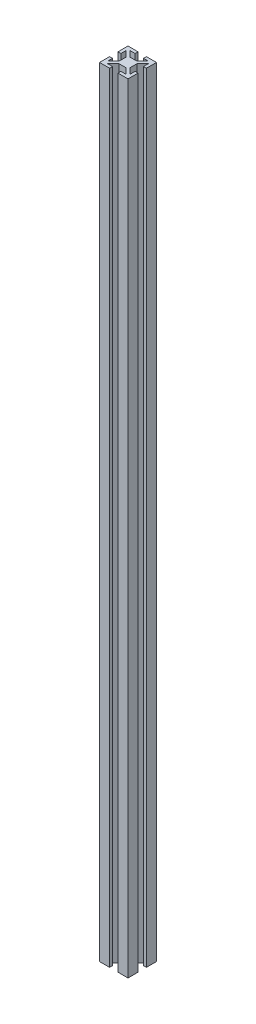
ISO-10303-21;
HEADER;
FILE_DESCRIPTION(('STEP AP214'),'2;1');
FILE_NAME('part.step','',(''),(''),'','','');
FILE_SCHEMA(('AUTOMOTIVE_DESIGN { 1 0 10303 214 1 1 1 1 }'));
ENDSEC;
DATA;
#1=APPLICATION_CONTEXT('core data for automotive mechanical design processes');
#2=APPLICATION_PROTOCOL_DEFINITION('international standard','automotive_design',2000,#1);
#3=PRODUCT_CONTEXT('',#1,'mechanical');
#4=PRODUCT('Part','Part','',(#3));
#5=PRODUCT_RELATED_PRODUCT_CATEGORY('part','',(#4));
#6=PRODUCT_DEFINITION_FORMATION('','',#4);
#7=PRODUCT_DEFINITION_CONTEXT('part definition',#1,'design');
#8=PRODUCT_DEFINITION('design','',#6,#7);
#9=PRODUCT_DEFINITION_SHAPE('','',#8);
#10=(LENGTH_UNIT() NAMED_UNIT(*) SI_UNIT(.MILLI.,.METRE.));
#11=(NAMED_UNIT(*) PLANE_ANGLE_UNIT() SI_UNIT($,.RADIAN.));
#12=(NAMED_UNIT(*) SI_UNIT($,.STERADIAN.) SOLID_ANGLE_UNIT());
#13=UNCERTAINTY_MEASURE_WITH_UNIT(LENGTH_MEASURE(1.E-05),#10,'distance_accuracy_value','');
#14=(GEOMETRIC_REPRESENTATION_CONTEXT(3) GLOBAL_UNCERTAINTY_ASSIGNED_CONTEXT((#13)) GLOBAL_UNIT_ASSIGNED_CONTEXT((#10,
#11,#12)) REPRESENTATION_CONTEXT('',''));
#15=CARTESIAN_POINT('',(0.,0.,0.));
#16=DIRECTION('',(0.,0.,1.));
#17=DIRECTION('',(1.,0.,0.));
#18=AXIS2_PLACEMENT_3D('',#15,#16,#17);
#19=CARTESIAN_POINT('',(4.1,762.,-13.925));
#20=DIRECTION('',(0.,0.,1.));
#21=DIRECTION('',(1.,0.,0.));
#22=AXIS2_PLACEMENT_3D('',#19,#20,#21);
#23=PLANE('',#22);
#24=DIRECTION('',(-1.,0.,0.));
#25=VECTOR('',#24,1.);
#26=CARTESIAN_POINT('',(4.1,0.,-13.925));
#27=LINE('',#26,#25);
#28=CARTESIAN_POINT('',(13.925,0.,-13.925));
#29=VERTEX_POINT('',#28);
#30=CARTESIAN_POINT('',(4.1,0.,-13.925));
#31=VERTEX_POINT('',#30);
#32=EDGE_CURVE('E314',#29,#31,#27,.T.);
#33=ORIENTED_EDGE('',*,*,#32,.T.);
#34=DIRECTION('',(0.,-1.,0.));
#35=VECTOR('',#34,1.);
#36=CARTESIAN_POINT('',(4.1,762.,-13.925));
#37=LINE('',#36,#35);
#38=CARTESIAN_POINT('',(4.1,762.,-13.925));
#39=VERTEX_POINT('',#38);
#40=EDGE_CURVE('E11',#39,#31,#37,.T.);
#41=ORIENTED_EDGE('',*,*,#40,.F.);
#42=DIRECTION('',(-1.,0.,0.));
#43=VECTOR('',#42,1.);
#44=CARTESIAN_POINT('',(4.1,762.,-13.925));
#45=LINE('',#44,#43);
#46=CARTESIAN_POINT('',(13.925,762.,-13.925));
#47=VERTEX_POINT('',#46);
#48=EDGE_CURVE('E420',#47,#39,#45,.T.);
#49=ORIENTED_EDGE('',*,*,#48,.F.);
#50=DIRECTION('',(0.,-1.,0.));
#51=VECTOR('',#50,1.);
#52=CARTESIAN_POINT('',(13.925,762.,-13.925));
#53=LINE('',#52,#51);
#54=EDGE_CURVE('E310',#47,#29,#53,.T.);
#55=ORIENTED_EDGE('',*,*,#54,.T.);
#56=EDGE_LOOP('',(#33,#41,#49,#55));
#57=FACE_BOUND('',#56,.T.);
#58=ADVANCED_FACE('F45',(#57),#23,.F.);
#59=CARTESIAN_POINT('',(4.1,762.,-13.925));
#60=DIRECTION('',(1.,0.,0.));
#61=DIRECTION('',(0.,0.,-1.));
#62=AXIS2_PLACEMENT_3D('',#59,#60,#61);
#63=PLANE('',#62);
#64=DIRECTION('',(0.,0.,1.));
#65=VECTOR('',#64,1.);
#66=CARTESIAN_POINT('',(4.1,0.,-13.925));
#67=LINE('',#66,#65);
#68=CARTESIAN_POINT('',(4.1,0.,-11.0400017946875));
#69=VERTEX_POINT('',#68);
#70=EDGE_CURVE('E318',#31,#69,#67,.T.);
#71=ORIENTED_EDGE('',*,*,#70,.T.);
#72=DIRECTION('',(0.,-1.,0.));
#73=VECTOR('',#72,1.);
#74=CARTESIAN_POINT('',(4.1,762.,-11.0400017946875));
#75=LINE('',#74,#73);
#76=CARTESIAN_POINT('',(4.1,762.,-11.0400017946875));
#77=VERTEX_POINT('',#76);
#78=EDGE_CURVE('E54',#77,#69,#75,.T.);
#79=ORIENTED_EDGE('',*,*,#78,.F.);
#80=DIRECTION('',(0.,0.,1.));
#81=VECTOR('',#80,1.);
#82=CARTESIAN_POINT('',(4.1,762.,-13.925));
#83=LINE('',#82,#81);
#84=EDGE_CURVE('E189',#39,#77,#83,.T.);
#85=ORIENTED_EDGE('',*,*,#84,.F.);
#86=ORIENTED_EDGE('',*,*,#40,.T.);
#87=EDGE_LOOP('',(#71,#79,#85,#86));
#88=FACE_BOUND('',#87,.T.);
#89=ADVANCED_FACE('F682',(#88),#63,.F.);
#90=CARTESIAN_POINT('',(4.1,762.,-11.0400017946875));
#91=DIRECTION('',(0.,0.,-1.));
#92=DIRECTION('',(-1.,0.,0.));
#93=AXIS2_PLACEMENT_3D('',#90,#91,#92);
#94=PLANE('',#93);
#95=DIRECTION('',(1.,0.,0.));
#96=VECTOR('',#95,1.);
#97=CARTESIAN_POINT('',(4.1,0.,-11.0400017946875));
#98=LINE('',#97,#96);
#99=CARTESIAN_POINT('',(9.,0.,-11.0400017946875));
#100=VERTEX_POINT('',#99);
#101=EDGE_CURVE('E321',#69,#100,#98,.T.);
#102=ORIENTED_EDGE('',*,*,#101,.T.);
#103=DIRECTION('',(0.,-1.,0.));
#104=VECTOR('',#103,1.);
#105=CARTESIAN_POINT('',(9.,762.,-11.0400017946875));
#106=LINE('',#105,#104);
#107=CARTESIAN_POINT('',(9.,762.,-11.0400017946875));
#108=VERTEX_POINT('',#107);
#109=EDGE_CURVE('E543',#108,#100,#106,.T.);
#110=ORIENTED_EDGE('',*,*,#109,.F.);
#111=DIRECTION('',(1.,0.,0.));
#112=VECTOR('',#111,1.);
#113=CARTESIAN_POINT('',(4.1,762.,-11.0400017946875));
#114=LINE('',#113,#112);
#115=EDGE_CURVE('E553',#77,#108,#114,.T.);
#116=ORIENTED_EDGE('',*,*,#115,.F.);
#117=ORIENTED_EDGE('',*,*,#78,.T.);
#118=EDGE_LOOP('',(#102,#110,#116,#117));
#119=FACE_BOUND('',#118,.T.);
#120=ADVANCED_FACE('F551',(#119),#94,.F.);
#121=CARTESIAN_POINT('',(9.,762.,-11.0400017946875));
#122=DIRECTION('',(0.707106781186548,0.,0.707106781186547));
#123=DIRECTION('',(0.707106781186547,0.,-0.707106781186548));
#124=AXIS2_PLACEMENT_3D('',#121,#122,#123);
#125=PLANE('',#124);
#126=DIRECTION('',(-0.707106781186547,0.,0.707106781186548));
#127=VECTOR('',#126,1.);
#128=CARTESIAN_POINT('',(9.,0.,-11.0400017946875));
#129=LINE('',#128,#127);
#130=CARTESIAN_POINT('',(3.44499820531251,0.,-5.485));
#131=VERTEX_POINT('',#130);
#132=EDGE_CURVE('E324',#100,#131,#129,.T.);
#133=ORIENTED_EDGE('',*,*,#132,.T.);
#134=DIRECTION('',(0.,-1.,0.));
#135=VECTOR('',#134,1.);
#136=CARTESIAN_POINT('',(3.44499820531251,762.,-5.485));
#137=LINE('',#136,#135);
#138=CARTESIAN_POINT('',(3.44499820531251,762.,-5.485));
#139=VERTEX_POINT('',#138);
#140=EDGE_CURVE('E539',#139,#131,#137,.T.);
#141=ORIENTED_EDGE('',*,*,#140,.F.);
#142=DIRECTION('',(-0.707106781186547,0.,0.707106781186548));
#143=VECTOR('',#142,1.);
#144=CARTESIAN_POINT('',(9.,762.,-11.0400017946875));
#145=LINE('',#144,#143);
#146=EDGE_CURVE('E572',#108,#139,#145,.T.);
#147=ORIENTED_EDGE('',*,*,#146,.F.);
#148=ORIENTED_EDGE('',*,*,#109,.T.);
#149=EDGE_LOOP('',(#133,#141,#147,#148));
#150=FACE_BOUND('',#149,.T.);
#151=ADVANCED_FACE('F562',(#150),#125,.F.);
#152=CARTESIAN_POINT('',(3.44499820531251,762.,-5.485));
#153=DIRECTION('',(0.,0.,1.));
#154=DIRECTION('',(1.,0.,0.));
#155=AXIS2_PLACEMENT_3D('',#152,#153,#154);
#156=PLANE('',#155);
#157=DIRECTION('',(-1.,0.,0.));
#158=VECTOR('',#157,1.);
#159=CARTESIAN_POINT('',(3.44499820531251,0.,-5.485));
#160=LINE('',#159,#158);
#161=CARTESIAN_POINT('',(-3.44499820531251,0.,-5.485));
#162=VERTEX_POINT('',#161);
#163=EDGE_CURVE('E327',#131,#162,#160,.T.);
#164=ORIENTED_EDGE('',*,*,#163,.T.);
#165=DIRECTION('',(0.,-1.,0.));
#166=VECTOR('',#165,1.);
#167=CARTESIAN_POINT('',(-3.44499820531251,762.,-5.485));
#168=LINE('',#167,#166);
#169=CARTESIAN_POINT('',(-3.44499820531251,762.,-5.485));
#170=VERTEX_POINT('',#169);
#171=EDGE_CURVE('E535',#170,#162,#168,.T.);
#172=ORIENTED_EDGE('',*,*,#171,.F.);
#173=DIRECTION('',(-1.,0.,0.));
#174=VECTOR('',#173,1.);
#175=CARTESIAN_POINT('',(3.44499820531251,762.,-5.485));
#176=LINE('',#175,#174);
#177=EDGE_CURVE('E568',#139,#170,#176,.T.);
#178=ORIENTED_EDGE('',*,*,#177,.F.);
#179=ORIENTED_EDGE('',*,*,#140,.T.);
#180=EDGE_LOOP('',(#164,#172,#178,#179));
#181=FACE_BOUND('',#180,.T.);
#182=ADVANCED_FACE('F566',(#181),#156,.F.);
#183=CARTESIAN_POINT('',(-9.,762.,-11.0400017946875));
#184=DIRECTION('',(-0.707106781186548,0.,0.707106781186547));
#185=DIRECTION('',(0.707106781186547,0.,0.707106781186548));
#186=AXIS2_PLACEMENT_3D('',#183,#184,#185);
#187=PLANE('',#186);
#188=DIRECTION('',(-0.707106781186547,0.,-0.707106781186548));
#189=VECTOR('',#188,1.);
#190=CARTESIAN_POINT('',(-9.,0.,-11.0400017946875));
#191=LINE('',#190,#189);
#192=CARTESIAN_POINT('',(-9.,0.,-11.0400017946875));
#193=VERTEX_POINT('',#192);
#194=EDGE_CURVE('E330',#162,#193,#191,.T.);
#195=ORIENTED_EDGE('',*,*,#194,.T.);
#196=DIRECTION('',(0.,-1.,0.));
#197=VECTOR('',#196,1.);
#198=CARTESIAN_POINT('',(-9.,762.,-11.0400017946875));
#199=LINE('',#198,#197);
#200=CARTESIAN_POINT('',(-9.,762.,-11.0400017946875));
#201=VERTEX_POINT('',#200);
#202=EDGE_CURVE('E531',#201,#193,#199,.T.);
#203=ORIENTED_EDGE('',*,*,#202,.F.);
#204=DIRECTION('',(-0.707106781186547,0.,-0.707106781186548));
#205=VECTOR('',#204,1.);
#206=CARTESIAN_POINT('',(-9.,762.,-11.0400017946875));
#207=LINE('',#206,#205);
#208=EDGE_CURVE('E571',#170,#201,#207,.T.);
#209=ORIENTED_EDGE('',*,*,#208,.F.);
#210=ORIENTED_EDGE('',*,*,#171,.T.);
#211=EDGE_LOOP('',(#195,#203,#209,#210));
#212=FACE_BOUND('',#211,.T.);
#213=ADVANCED_FACE('F695',(#212),#187,.F.);
#214=CARTESIAN_POINT('',(-4.1,762.,-11.0400017946875));
#215=DIRECTION('',(0.,0.,-1.));
#216=DIRECTION('',(-1.,0.,0.));
#217=AXIS2_PLACEMENT_3D('',#214,#215,#216);
#218=PLANE('',#217);
#219=DIRECTION('',(1.,0.,0.));
#220=VECTOR('',#219,1.);
#221=CARTESIAN_POINT('',(-4.1,0.,-11.0400017946875));
#222=LINE('',#221,#220);
#223=CARTESIAN_POINT('',(-4.1,0.,-11.0400017946875));
#224=VERTEX_POINT('',#223);
#225=EDGE_CURVE('E333',#193,#224,#222,.T.);
#226=ORIENTED_EDGE('',*,*,#225,.T.);
#227=DIRECTION('',(0.,-1.,0.));
#228=VECTOR('',#227,1.);
#229=CARTESIAN_POINT('',(-4.1,762.,-11.0400017946875));
#230=LINE('',#229,#228);
#231=CARTESIAN_POINT('',(-4.1,762.,-11.0400017946875));
#232=VERTEX_POINT('',#231);
#233=EDGE_CURVE('E527',#232,#224,#230,.T.);
#234=ORIENTED_EDGE('',*,*,#233,.F.);
#235=DIRECTION('',(1.,0.,0.));
#236=VECTOR('',#235,1.);
#237=CARTESIAN_POINT('',(-4.1,762.,-11.0400017946875));
#238=LINE('',#237,#236);
#239=EDGE_CURVE('E576',#201,#232,#238,.T.);
#240=ORIENTED_EDGE('',*,*,#239,.F.);
#241=ORIENTED_EDGE('',*,*,#202,.T.);
#242=EDGE_LOOP('',(#226,#234,#240,#241));
#243=FACE_BOUND('',#242,.T.);
#244=ADVANCED_FACE('F698',(#243),#218,.F.);
#245=CARTESIAN_POINT('',(-4.1,762.,-13.925));
#246=DIRECTION('',(-1.,0.,0.));
#247=DIRECTION('',(0.,0.,1.));
#248=AXIS2_PLACEMENT_3D('',#245,#246,#247);
#249=PLANE('',#248);
#250=DIRECTION('',(0.,0.,-1.));
#251=VECTOR('',#250,1.);
#252=CARTESIAN_POINT('',(-4.1,0.,-13.925));
#253=LINE('',#252,#251);
#254=CARTESIAN_POINT('',(-4.1,0.,-13.925));
#255=VERTEX_POINT('',#254);
#256=EDGE_CURVE('E336',#224,#255,#253,.T.);
#257=ORIENTED_EDGE('',*,*,#256,.T.);
#258=DIRECTION('',(0.,-1.,0.));
#259=VECTOR('',#258,1.);
#260=CARTESIAN_POINT('',(-4.1,762.,-13.925));
#261=LINE('',#260,#259);
#262=CARTESIAN_POINT('',(-4.1,762.,-13.925));
#263=VERTEX_POINT('',#262);
#264=EDGE_CURVE('E523',#263,#255,#261,.T.);
#265=ORIENTED_EDGE('',*,*,#264,.F.);
#266=DIRECTION('',(0.,0.,-1.));
#267=VECTOR('',#266,1.);
#268=CARTESIAN_POINT('',(-4.1,762.,-13.925));
#269=LINE('',#268,#267);
#270=EDGE_CURVE('E583',#232,#263,#269,.T.);
#271=ORIENTED_EDGE('',*,*,#270,.F.);
#272=ORIENTED_EDGE('',*,*,#233,.T.);
#273=EDGE_LOOP('',(#257,#265,#271,#272));
#274=FACE_BOUND('',#273,.T.);
#275=ADVANCED_FACE('F702',(#274),#249,.F.);
#276=CARTESIAN_POINT('',(-13.925,762.,-13.925));
#277=DIRECTION('',(0.,0.,1.));
#278=DIRECTION('',(1.,0.,0.));
#279=AXIS2_PLACEMENT_3D('',#276,#277,#278);
#280=PLANE('',#279);
#281=DIRECTION('',(-1.,0.,0.));
#282=VECTOR('',#281,1.);
#283=CARTESIAN_POINT('',(-13.925,0.,-13.925));
#284=LINE('',#283,#282);
#285=CARTESIAN_POINT('',(-13.925,0.,-13.925));
#286=VERTEX_POINT('',#285);
#287=EDGE_CURVE('E339',#255,#286,#284,.T.);
#288=ORIENTED_EDGE('',*,*,#287,.T.);
#289=DIRECTION('',(0.,-1.,0.));
#290=VECTOR('',#289,1.);
#291=CARTESIAN_POINT('',(-13.925,762.,-13.925));
#292=LINE('',#291,#290);
#293=CARTESIAN_POINT('',(-13.925,762.,-13.925));
#294=VERTEX_POINT('',#293);
#295=EDGE_CURVE('E519',#294,#286,#292,.T.);
#296=ORIENTED_EDGE('',*,*,#295,.F.);
#297=DIRECTION('',(-1.,0.,0.));
#298=VECTOR('',#297,1.);
#299=CARTESIAN_POINT('',(-13.925,762.,-13.925));
#300=LINE('',#299,#298);
#301=EDGE_CURVE('E586',#263,#294,#300,.T.);
#302=ORIENTED_EDGE('',*,*,#301,.F.);
#303=ORIENTED_EDGE('',*,*,#264,.T.);
#304=EDGE_LOOP('',(#288,#296,#302,#303));
#305=FACE_BOUND('',#304,.T.);
#306=ADVANCED_FACE('F706',(#305),#280,.F.);
#307=CARTESIAN_POINT('',(-13.925,762.,-4.10000000000001));
#308=DIRECTION('',(1.,0.,0.));
#309=DIRECTION('',(0.,0.,-1.));
#310=AXIS2_PLACEMENT_3D('',#307,#308,#309);
#311=PLANE('',#310);
#312=DIRECTION('',(0.,0.,1.));
#313=VECTOR('',#312,1.);
#314=CARTESIAN_POINT('',(-13.925,0.,-4.10000000000001));
#315=LINE('',#314,#313);
#316=CARTESIAN_POINT('',(-13.925,0.,-4.10000000000001));
#317=VERTEX_POINT('',#316);
#318=EDGE_CURVE('E342',#286,#317,#315,.T.);
#319=ORIENTED_EDGE('',*,*,#318,.T.);
#320=DIRECTION('',(0.,-1.,0.));
#321=VECTOR('',#320,1.);
#322=CARTESIAN_POINT('',(-13.925,762.,-4.10000000000001));
#323=LINE('',#322,#321);
#324=CARTESIAN_POINT('',(-13.925,762.,-4.10000000000001));
#325=VERTEX_POINT('',#324);
#326=EDGE_CURVE('E515',#325,#317,#323,.T.);
#327=ORIENTED_EDGE('',*,*,#326,.F.);
#328=DIRECTION('',(0.,0.,1.));
#329=VECTOR('',#328,1.);
#330=CARTESIAN_POINT('',(-13.925,762.,-4.10000000000001));
#331=LINE('',#330,#329);
#332=EDGE_CURVE('E589',#294,#325,#331,.T.);
#333=ORIENTED_EDGE('',*,*,#332,.F.);
#334=ORIENTED_EDGE('',*,*,#295,.T.);
#335=EDGE_LOOP('',(#319,#327,#333,#334));
#336=FACE_BOUND('',#335,.T.);
#337=ADVANCED_FACE('F710',(#336),#311,.F.);
#338=CARTESIAN_POINT('',(-13.925,762.,-4.10000000000001));
#339=DIRECTION('',(0.,0.,-1.));
#340=DIRECTION('',(-1.,0.,0.));
#341=AXIS2_PLACEMENT_3D('',#338,#339,#340);
#342=PLANE('',#341);
#343=DIRECTION('',(1.,0.,0.));
#344=VECTOR('',#343,1.);
#345=CARTESIAN_POINT('',(-13.925,0.,-4.10000000000001));
#346=LINE('',#345,#344);
#347=CARTESIAN_POINT('',(-11.0400017946875,0.,-4.1));
#348=VERTEX_POINT('',#347);
#349=EDGE_CURVE('E345',#317,#348,#346,.T.);
#350=ORIENTED_EDGE('',*,*,#349,.T.);
#351=DIRECTION('',(0.,-1.,0.));
#352=VECTOR('',#351,1.);
#353=CARTESIAN_POINT('',(-11.0400017946875,762.,-4.1));
#354=LINE('',#353,#352);
#355=CARTESIAN_POINT('',(-11.0400017946875,762.,-4.1));
#356=VERTEX_POINT('',#355);
#357=EDGE_CURVE('E511',#356,#348,#354,.T.);
#358=ORIENTED_EDGE('',*,*,#357,.F.);
#359=DIRECTION('',(1.,0.,0.));
#360=VECTOR('',#359,1.);
#361=CARTESIAN_POINT('',(-13.925,762.,-4.10000000000001));
#362=LINE('',#361,#360);
#363=EDGE_CURVE('E592',#325,#356,#362,.T.);
#364=ORIENTED_EDGE('',*,*,#363,.F.);
#365=ORIENTED_EDGE('',*,*,#326,.T.);
#366=EDGE_LOOP('',(#350,#358,#364,#365));
#367=FACE_BOUND('',#366,.T.);
#368=ADVANCED_FACE('F714',(#367),#342,.F.);
#369=CARTESIAN_POINT('',(-11.0400017946875,762.,-4.1));
#370=DIRECTION('',(-1.,0.,0.));
#371=DIRECTION('',(0.,0.,1.));
#372=AXIS2_PLACEMENT_3D('',#369,#370,#371);
#373=PLANE('',#372);
#374=DIRECTION('',(0.,0.,-1.));
#375=VECTOR('',#374,1.);
#376=CARTESIAN_POINT('',(-11.0400017946875,0.,-4.1));
#377=LINE('',#376,#375);
#378=CARTESIAN_POINT('',(-11.0400017946875,0.,-9.));
#379=VERTEX_POINT('',#378);
#380=EDGE_CURVE('E348',#348,#379,#377,.T.);
#381=ORIENTED_EDGE('',*,*,#380,.T.);
#382=DIRECTION('',(0.,-1.,0.));
#383=VECTOR('',#382,1.);
#384=CARTESIAN_POINT('',(-11.0400017946875,762.,-9.));
#385=LINE('',#384,#383);
#386=CARTESIAN_POINT('',(-11.0400017946875,762.,-9.));
#387=VERTEX_POINT('',#386);
#388=EDGE_CURVE('E507',#387,#379,#385,.T.);
#389=ORIENTED_EDGE('',*,*,#388,.F.);
#390=DIRECTION('',(0.,0.,-1.));
#391=VECTOR('',#390,1.);
#392=CARTESIAN_POINT('',(-11.0400017946875,762.,-4.1));
#393=LINE('',#392,#391);
#394=EDGE_CURVE('E595',#356,#387,#393,.T.);
#395=ORIENTED_EDGE('',*,*,#394,.F.);
#396=ORIENTED_EDGE('',*,*,#357,.T.);
#397=EDGE_LOOP('',(#381,#389,#395,#396));
#398=FACE_BOUND('',#397,.T.);
#399=ADVANCED_FACE('F718',(#398),#373,.F.);
#400=CARTESIAN_POINT('',(-11.0400017946875,762.,-9.));
#401=DIRECTION('',(0.707106781186547,0.,-0.707106781186547));
#402=DIRECTION('',(-0.707106781186548,0.,-0.707106781186548));
#403=AXIS2_PLACEMENT_3D('',#400,#401,#402);
#404=PLANE('',#403);
#405=DIRECTION('',(0.707106781186548,0.,0.707106781186548));
#406=VECTOR('',#405,1.);
#407=CARTESIAN_POINT('',(-11.0400017946875,0.,-9.));
#408=LINE('',#407,#406);
#409=CARTESIAN_POINT('',(-5.485,0.,-3.44499820531251));
#410=VERTEX_POINT('',#409);
#411=EDGE_CURVE('E351',#379,#410,#408,.T.);
#412=ORIENTED_EDGE('',*,*,#411,.T.);
#413=DIRECTION('',(0.,-1.,0.));
#414=VECTOR('',#413,1.);
#415=CARTESIAN_POINT('',(-5.485,762.,-3.44499820531251));
#416=LINE('',#415,#414);
#417=CARTESIAN_POINT('',(-5.485,762.,-3.44499820531251));
#418=VERTEX_POINT('',#417);
#419=EDGE_CURVE('E503',#418,#410,#416,.T.);
#420=ORIENTED_EDGE('',*,*,#419,.F.);
#421=DIRECTION('',(0.707106781186548,0.,0.707106781186548));
#422=VECTOR('',#421,1.);
#423=CARTESIAN_POINT('',(-11.0400017946875,762.,-9.));
#424=LINE('',#423,#422);
#425=EDGE_CURVE('E598',#387,#418,#424,.T.);
#426=ORIENTED_EDGE('',*,*,#425,.F.);
#427=ORIENTED_EDGE('',*,*,#388,.T.);
#428=EDGE_LOOP('',(#412,#420,#426,#427));
#429=FACE_BOUND('',#428,.T.);
#430=ADVANCED_FACE('F722',(#429),#404,.F.);
#431=CARTESIAN_POINT('',(-5.485,762.,-3.44499820531251));
#432=DIRECTION('',(1.,0.,0.));
#433=DIRECTION('',(0.,0.,-1.));
#434=AXIS2_PLACEMENT_3D('',#431,#432,#433);
#435=PLANE('',#434);
#436=DIRECTION('',(0.,0.,1.));
#437=VECTOR('',#436,1.);
#438=CARTESIAN_POINT('',(-5.485,0.,-3.44499820531251));
#439=LINE('',#438,#437);
#440=CARTESIAN_POINT('',(-5.485,0.,3.44499820531251));
#441=VERTEX_POINT('',#440);
#442=EDGE_CURVE('E354',#410,#441,#439,.T.);
#443=ORIENTED_EDGE('',*,*,#442,.T.);
#444=DIRECTION('',(0.,-1.,0.));
#445=VECTOR('',#444,1.);
#446=CARTESIAN_POINT('',(-5.485,762.,3.44499820531251));
#447=LINE('',#446,#445);
#448=CARTESIAN_POINT('',(-5.485,762.,3.44499820531251));
#449=VERTEX_POINT('',#448);
#450=EDGE_CURVE('E499',#449,#441,#447,.T.);
#451=ORIENTED_EDGE('',*,*,#450,.F.);
#452=DIRECTION('',(0.,0.,1.));
#453=VECTOR('',#452,1.);
#454=CARTESIAN_POINT('',(-5.485,762.,-3.44499820531251));
#455=LINE('',#454,#453);
#456=EDGE_CURVE('E601',#418,#449,#455,.T.);
#457=ORIENTED_EDGE('',*,*,#456,.F.);
#458=ORIENTED_EDGE('',*,*,#419,.T.);
#459=EDGE_LOOP('',(#443,#451,#457,#458));
#460=FACE_BOUND('',#459,.T.);
#461=ADVANCED_FACE('F726',(#460),#435,.F.);
#462=CARTESIAN_POINT('',(-11.0400017946875,762.,9.));
#463=DIRECTION('',(0.707106781186547,0.,0.707106781186547));
#464=DIRECTION('',(0.707106781186548,0.,-0.707106781186548));
#465=AXIS2_PLACEMENT_3D('',#462,#463,#464);
#466=PLANE('',#465);
#467=DIRECTION('',(-0.707106781186548,0.,0.707106781186548));
#468=VECTOR('',#467,1.);
#469=CARTESIAN_POINT('',(-11.0400017946875,0.,9.));
#470=LINE('',#469,#468);
#471=CARTESIAN_POINT('',(-11.0400017946875,0.,9.));
#472=VERTEX_POINT('',#471);
#473=EDGE_CURVE('E357',#441,#472,#470,.T.);
#474=ORIENTED_EDGE('',*,*,#473,.T.);
#475=DIRECTION('',(0.,-1.,0.));
#476=VECTOR('',#475,1.);
#477=CARTESIAN_POINT('',(-11.0400017946875,762.,9.));
#478=LINE('',#477,#476);
#479=CARTESIAN_POINT('',(-11.0400017946875,762.,9.));
#480=VERTEX_POINT('',#479);
#481=EDGE_CURVE('E495',#480,#472,#478,.T.);
#482=ORIENTED_EDGE('',*,*,#481,.F.);
#483=DIRECTION('',(-0.707106781186548,0.,0.707106781186548));
#484=VECTOR('',#483,1.);
#485=CARTESIAN_POINT('',(-11.0400017946875,762.,9.));
#486=LINE('',#485,#484);
#487=EDGE_CURVE('E604',#449,#480,#486,.T.);
#488=ORIENTED_EDGE('',*,*,#487,.F.);
#489=ORIENTED_EDGE('',*,*,#450,.T.);
#490=EDGE_LOOP('',(#474,#482,#488,#489));
#491=FACE_BOUND('',#490,.T.);
#492=ADVANCED_FACE('F730',(#491),#466,.F.);
#493=CARTESIAN_POINT('',(-11.0400017946875,762.,4.1));
#494=DIRECTION('',(-1.,0.,0.));
#495=DIRECTION('',(0.,0.,1.));
#496=AXIS2_PLACEMENT_3D('',#493,#494,#495);
#497=PLANE('',#496);
#498=DIRECTION('',(0.,0.,-1.));
#499=VECTOR('',#498,1.);
#500=CARTESIAN_POINT('',(-11.0400017946875,0.,4.1));
#501=LINE('',#500,#499);
#502=CARTESIAN_POINT('',(-11.0400017946875,0.,4.1));
#503=VERTEX_POINT('',#502);
#504=EDGE_CURVE('E360',#472,#503,#501,.T.);
#505=ORIENTED_EDGE('',*,*,#504,.T.);
#506=DIRECTION('',(0.,-1.,0.));
#507=VECTOR('',#506,1.);
#508=CARTESIAN_POINT('',(-11.0400017946875,762.,4.1));
#509=LINE('',#508,#507);
#510=CARTESIAN_POINT('',(-11.0400017946875,762.,4.1));
#511=VERTEX_POINT('',#510);
#512=EDGE_CURVE('E491',#511,#503,#509,.T.);
#513=ORIENTED_EDGE('',*,*,#512,.F.);
#514=DIRECTION('',(0.,0.,-1.));
#515=VECTOR('',#514,1.);
#516=CARTESIAN_POINT('',(-11.0400017946875,762.,4.1));
#517=LINE('',#516,#515);
#518=EDGE_CURVE('E607',#480,#511,#517,.T.);
#519=ORIENTED_EDGE('',*,*,#518,.F.);
#520=ORIENTED_EDGE('',*,*,#481,.T.);
#521=EDGE_LOOP('',(#505,#513,#519,#520));
#522=FACE_BOUND('',#521,.T.);
#523=ADVANCED_FACE('F734',(#522),#497,.F.);
#524=CARTESIAN_POINT('',(-13.925,762.,4.10000000000001));
#525=DIRECTION('',(0.,0.,1.));
#526=DIRECTION('',(1.,0.,0.));
#527=AXIS2_PLACEMENT_3D('',#524,#525,#526);
#528=PLANE('',#527);
#529=DIRECTION('',(-1.,0.,0.));
#530=VECTOR('',#529,1.);
#531=CARTESIAN_POINT('',(-13.925,0.,4.10000000000001));
#532=LINE('',#531,#530);
#533=CARTESIAN_POINT('',(-13.925,0.,4.10000000000001));
#534=VERTEX_POINT('',#533);
#535=EDGE_CURVE('E363',#503,#534,#532,.T.);
#536=ORIENTED_EDGE('',*,*,#535,.T.);
#537=DIRECTION('',(0.,-1.,0.));
#538=VECTOR('',#537,1.);
#539=CARTESIAN_POINT('',(-13.925,762.,4.10000000000001));
#540=LINE('',#539,#538);
#541=CARTESIAN_POINT('',(-13.925,762.,4.10000000000001));
#542=VERTEX_POINT('',#541);
#543=EDGE_CURVE('E487',#542,#534,#540,.T.);
#544=ORIENTED_EDGE('',*,*,#543,.F.);
#545=DIRECTION('',(-1.,0.,0.));
#546=VECTOR('',#545,1.);
#547=CARTESIAN_POINT('',(-13.925,762.,4.10000000000001));
#548=LINE('',#547,#546);
#549=EDGE_CURVE('E610',#511,#542,#548,.T.);
#550=ORIENTED_EDGE('',*,*,#549,.F.);
#551=ORIENTED_EDGE('',*,*,#512,.T.);
#552=EDGE_LOOP('',(#536,#544,#550,#551));
#553=FACE_BOUND('',#552,.T.);
#554=ADVANCED_FACE('F738',(#553),#528,.F.);
#555=CARTESIAN_POINT('',(-13.925,762.,13.925));
#556=DIRECTION('',(1.,0.,0.));
#557=DIRECTION('',(0.,0.,-1.));
#558=AXIS2_PLACEMENT_3D('',#555,#556,#557);
#559=PLANE('',#558);
#560=DIRECTION('',(0.,0.,1.));
#561=VECTOR('',#560,1.);
#562=CARTESIAN_POINT('',(-13.925,0.,13.925));
#563=LINE('',#562,#561);
#564=CARTESIAN_POINT('',(-13.925,0.,13.925));
#565=VERTEX_POINT('',#564);
#566=EDGE_CURVE('E366',#534,#565,#563,.T.);
#567=ORIENTED_EDGE('',*,*,#566,.T.);
#568=DIRECTION('',(0.,-1.,0.));
#569=VECTOR('',#568,1.);
#570=CARTESIAN_POINT('',(-13.925,762.,13.925));
#571=LINE('',#570,#569);
#572=CARTESIAN_POINT('',(-13.925,762.,13.925));
#573=VERTEX_POINT('',#572);
#574=EDGE_CURVE('E483',#573,#565,#571,.T.);
#575=ORIENTED_EDGE('',*,*,#574,.F.);
#576=DIRECTION('',(0.,0.,1.));
#577=VECTOR('',#576,1.);
#578=CARTESIAN_POINT('',(-13.925,762.,13.925));
#579=LINE('',#578,#577);
#580=EDGE_CURVE('E613',#542,#573,#579,.T.);
#581=ORIENTED_EDGE('',*,*,#580,.F.);
#582=ORIENTED_EDGE('',*,*,#543,.T.);
#583=EDGE_LOOP('',(#567,#575,#581,#582));
#584=FACE_BOUND('',#583,.T.);
#585=ADVANCED_FACE('F742',(#584),#559,.F.);
#586=CARTESIAN_POINT('',(-13.925,762.,13.925));
#587=DIRECTION('',(0.,0.,-1.));
#588=DIRECTION('',(-1.,0.,0.));
#589=AXIS2_PLACEMENT_3D('',#586,#587,#588);
#590=PLANE('',#589);
#591=DIRECTION('',(1.,0.,0.));
#592=VECTOR('',#591,1.);
#593=CARTESIAN_POINT('',(-13.925,0.,13.925));
#594=LINE('',#593,#592);
#595=CARTESIAN_POINT('',(-4.1,0.,13.925));
#596=VERTEX_POINT('',#595);
#597=EDGE_CURVE('E369',#565,#596,#594,.T.);
#598=ORIENTED_EDGE('',*,*,#597,.T.);
#599=DIRECTION('',(0.,-1.,0.));
#600=VECTOR('',#599,1.);
#601=CARTESIAN_POINT('',(-4.1,762.,13.925));
#602=LINE('',#601,#600);
#603=CARTESIAN_POINT('',(-4.1,762.,13.925));
#604=VERTEX_POINT('',#603);
#605=EDGE_CURVE('E479',#604,#596,#602,.T.);
#606=ORIENTED_EDGE('',*,*,#605,.F.);
#607=DIRECTION('',(1.,0.,0.));
#608=VECTOR('',#607,1.);
#609=CARTESIAN_POINT('',(-13.925,762.,13.925));
#610=LINE('',#609,#608);
#611=EDGE_CURVE('E616',#573,#604,#610,.T.);
#612=ORIENTED_EDGE('',*,*,#611,.F.);
#613=ORIENTED_EDGE('',*,*,#574,.T.);
#614=EDGE_LOOP('',(#598,#606,#612,#613));
#615=FACE_BOUND('',#614,.T.);
#616=ADVANCED_FACE('F746',(#615),#590,.F.);
#617=CARTESIAN_POINT('',(-4.1,762.,13.925));
#618=DIRECTION('',(-1.,0.,0.));
#619=DIRECTION('',(0.,0.,1.));
#620=AXIS2_PLACEMENT_3D('',#617,#618,#619);
#621=PLANE('',#620);
#622=DIRECTION('',(0.,0.,-1.));
#623=VECTOR('',#622,1.);
#624=CARTESIAN_POINT('',(-4.1,0.,13.925));
#625=LINE('',#624,#623);
#626=CARTESIAN_POINT('',(-4.1,0.,11.0400017946875));
#627=VERTEX_POINT('',#626);
#628=EDGE_CURVE('E372',#596,#627,#625,.T.);
#629=ORIENTED_EDGE('',*,*,#628,.T.);
#630=DIRECTION('',(0.,-1.,0.));
#631=VECTOR('',#630,1.);
#632=CARTESIAN_POINT('',(-4.1,762.,11.0400017946875));
#633=LINE('',#632,#631);
#634=CARTESIAN_POINT('',(-4.1,762.,11.0400017946875));
#635=VERTEX_POINT('',#634);
#636=EDGE_CURVE('E475',#635,#627,#633,.T.);
#637=ORIENTED_EDGE('',*,*,#636,.F.);
#638=DIRECTION('',(0.,0.,-1.));
#639=VECTOR('',#638,1.);
#640=CARTESIAN_POINT('',(-4.1,762.,13.925));
#641=LINE('',#640,#639);
#642=EDGE_CURVE('E619',#604,#635,#641,.T.);
#643=ORIENTED_EDGE('',*,*,#642,.F.);
#644=ORIENTED_EDGE('',*,*,#605,.T.);
#645=EDGE_LOOP('',(#629,#637,#643,#644));
#646=FACE_BOUND('',#645,.T.);
#647=ADVANCED_FACE('F750',(#646),#621,.F.);
#648=CARTESIAN_POINT('',(-4.1,762.,11.0400017946875));
#649=DIRECTION('',(0.,0.,1.));
#650=DIRECTION('',(1.,0.,0.));
#651=AXIS2_PLACEMENT_3D('',#648,#649,#650);
#652=PLANE('',#651);
#653=DIRECTION('',(-1.,0.,0.));
#654=VECTOR('',#653,1.);
#655=CARTESIAN_POINT('',(-4.1,0.,11.0400017946875));
#656=LINE('',#655,#654);
#657=CARTESIAN_POINT('',(-9.,0.,11.0400017946875));
#658=VERTEX_POINT('',#657);
#659=EDGE_CURVE('E375',#627,#658,#656,.T.);
#660=ORIENTED_EDGE('',*,*,#659,.T.);
#661=DIRECTION('',(0.,-1.,0.));
#662=VECTOR('',#661,1.);
#663=CARTESIAN_POINT('',(-9.,762.,11.0400017946875));
#664=LINE('',#663,#662);
#665=CARTESIAN_POINT('',(-9.,762.,11.0400017946875));
#666=VERTEX_POINT('',#665);
#667=EDGE_CURVE('E471',#666,#658,#664,.T.);
#668=ORIENTED_EDGE('',*,*,#667,.F.);
#669=DIRECTION('',(-1.,0.,0.));
#670=VECTOR('',#669,1.);
#671=CARTESIAN_POINT('',(-4.1,762.,11.0400017946875));
#672=LINE('',#671,#670);
#673=EDGE_CURVE('E622',#635,#666,#672,.T.);
#674=ORIENTED_EDGE('',*,*,#673,.F.);
#675=ORIENTED_EDGE('',*,*,#636,.T.);
#676=EDGE_LOOP('',(#660,#668,#674,#675));
#677=FACE_BOUND('',#676,.T.);
#678=ADVANCED_FACE('F754',(#677),#652,.F.);
#679=CARTESIAN_POINT('',(-9.,762.,11.0400017946875));
#680=DIRECTION('',(-0.707106781186548,0.,-0.707106781186547));
#681=DIRECTION('',(-0.707106781186547,0.,0.707106781186548));
#682=AXIS2_PLACEMENT_3D('',#679,#680,#681);
#683=PLANE('',#682);
#684=DIRECTION('',(0.707106781186547,0.,-0.707106781186548));
#685=VECTOR('',#684,1.);
#686=CARTESIAN_POINT('',(-9.,0.,11.0400017946875));
#687=LINE('',#686,#685);
#688=CARTESIAN_POINT('',(-3.44499820531251,0.,5.485));
#689=VERTEX_POINT('',#688);
#690=EDGE_CURVE('E378',#658,#689,#687,.T.);
#691=ORIENTED_EDGE('',*,*,#690,.T.);
#692=DIRECTION('',(0.,-1.,0.));
#693=VECTOR('',#692,1.);
#694=CARTESIAN_POINT('',(-3.44499820531251,762.,5.485));
#695=LINE('',#694,#693);
#696=CARTESIAN_POINT('',(-3.44499820531251,762.,5.485));
#697=VERTEX_POINT('',#696);
#698=EDGE_CURVE('E467',#697,#689,#695,.T.);
#699=ORIENTED_EDGE('',*,*,#698,.F.);
#700=DIRECTION('',(0.707106781186547,0.,-0.707106781186548));
#701=VECTOR('',#700,1.);
#702=CARTESIAN_POINT('',(-9.,762.,11.0400017946875));
#703=LINE('',#702,#701);
#704=EDGE_CURVE('E625',#666,#697,#703,.T.);
#705=ORIENTED_EDGE('',*,*,#704,.F.);
#706=ORIENTED_EDGE('',*,*,#667,.T.);
#707=EDGE_LOOP('',(#691,#699,#705,#706));
#708=FACE_BOUND('',#707,.T.);
#709=ADVANCED_FACE('F758',(#708),#683,.F.);
#710=CARTESIAN_POINT('',(3.44499820531251,762.,5.485));
#711=DIRECTION('',(0.,0.,-1.));
#712=DIRECTION('',(-1.,0.,0.));
#713=AXIS2_PLACEMENT_3D('',#710,#711,#712);
#714=PLANE('',#713);
#715=DIRECTION('',(1.,0.,0.));
#716=VECTOR('',#715,1.);
#717=CARTESIAN_POINT('',(3.44499820531251,0.,5.485));
#718=LINE('',#717,#716);
#719=CARTESIAN_POINT('',(3.44499820531251,0.,5.485));
#720=VERTEX_POINT('',#719);
#721=EDGE_CURVE('E381',#689,#720,#718,.T.);
#722=ORIENTED_EDGE('',*,*,#721,.T.);
#723=DIRECTION('',(0.,-1.,0.));
#724=VECTOR('',#723,1.);
#725=CARTESIAN_POINT('',(3.44499820531251,762.,5.485));
#726=LINE('',#725,#724);
#727=CARTESIAN_POINT('',(3.44499820531251,762.,5.485));
#728=VERTEX_POINT('',#727);
#729=EDGE_CURVE('E463',#728,#720,#726,.T.);
#730=ORIENTED_EDGE('',*,*,#729,.F.);
#731=DIRECTION('',(1.,0.,0.));
#732=VECTOR('',#731,1.);
#733=CARTESIAN_POINT('',(3.44499820531251,762.,5.485));
#734=LINE('',#733,#732);
#735=EDGE_CURVE('E628',#697,#728,#734,.T.);
#736=ORIENTED_EDGE('',*,*,#735,.F.);
#737=ORIENTED_EDGE('',*,*,#698,.T.);
#738=EDGE_LOOP('',(#722,#730,#736,#737));
#739=FACE_BOUND('',#738,.T.);
#740=ADVANCED_FACE('F762',(#739),#714,.F.);
#741=CARTESIAN_POINT('',(9.,762.,11.0400017946875));
#742=DIRECTION('',(0.707106781186548,0.,-0.707106781186547));
#743=DIRECTION('',(-0.707106781186547,0.,-0.707106781186548));
#744=AXIS2_PLACEMENT_3D('',#741,#742,#743);
#745=PLANE('',#744);
#746=DIRECTION('',(0.707106781186547,0.,0.707106781186548));
#747=VECTOR('',#746,1.);
#748=CARTESIAN_POINT('',(9.,0.,11.0400017946875));
#749=LINE('',#748,#747);
#750=CARTESIAN_POINT('',(9.,0.,11.0400017946875));
#751=VERTEX_POINT('',#750);
#752=EDGE_CURVE('E384',#720,#751,#749,.T.);
#753=ORIENTED_EDGE('',*,*,#752,.T.);
#754=DIRECTION('',(0.,-1.,0.));
#755=VECTOR('',#754,1.);
#756=CARTESIAN_POINT('',(9.,762.,11.0400017946875));
#757=LINE('',#756,#755);
#758=CARTESIAN_POINT('',(9.,762.,11.0400017946875));
#759=VERTEX_POINT('',#758);
#760=EDGE_CURVE('E459',#759,#751,#757,.T.);
#761=ORIENTED_EDGE('',*,*,#760,.F.);
#762=DIRECTION('',(0.707106781186547,0.,0.707106781186548));
#763=VECTOR('',#762,1.);
#764=CARTESIAN_POINT('',(9.,762.,11.0400017946875));
#765=LINE('',#764,#763);
#766=EDGE_CURVE('E631',#728,#759,#765,.T.);
#767=ORIENTED_EDGE('',*,*,#766,.F.);
#768=ORIENTED_EDGE('',*,*,#729,.T.);
#769=EDGE_LOOP('',(#753,#761,#767,#768));
#770=FACE_BOUND('',#769,.T.);
#771=ADVANCED_FACE('F766',(#770),#745,.F.);
#772=CARTESIAN_POINT('',(4.1,762.,11.0400017946875));
#773=DIRECTION('',(0.,0.,1.));
#774=DIRECTION('',(1.,0.,0.));
#775=AXIS2_PLACEMENT_3D('',#772,#773,#774);
#776=PLANE('',#775);
#777=DIRECTION('',(-1.,0.,0.));
#778=VECTOR('',#777,1.);
#779=CARTESIAN_POINT('',(4.1,0.,11.0400017946875));
#780=LINE('',#779,#778);
#781=CARTESIAN_POINT('',(4.1,0.,11.0400017946875));
#782=VERTEX_POINT('',#781);
#783=EDGE_CURVE('E387',#751,#782,#780,.T.);
#784=ORIENTED_EDGE('',*,*,#783,.T.);
#785=DIRECTION('',(0.,-1.,0.));
#786=VECTOR('',#785,1.);
#787=CARTESIAN_POINT('',(4.1,762.,11.0400017946875));
#788=LINE('',#787,#786);
#789=CARTESIAN_POINT('',(4.1,762.,11.0400017946875));
#790=VERTEX_POINT('',#789);
#791=EDGE_CURVE('E455',#790,#782,#788,.T.);
#792=ORIENTED_EDGE('',*,*,#791,.F.);
#793=DIRECTION('',(-1.,0.,0.));
#794=VECTOR('',#793,1.);
#795=CARTESIAN_POINT('',(4.1,762.,11.0400017946875));
#796=LINE('',#795,#794);
#797=EDGE_CURVE('E634',#759,#790,#796,.T.);
#798=ORIENTED_EDGE('',*,*,#797,.F.);
#799=ORIENTED_EDGE('',*,*,#760,.T.);
#800=EDGE_LOOP('',(#784,#792,#798,#799));
#801=FACE_BOUND('',#800,.T.);
#802=ADVANCED_FACE('F770',(#801),#776,.F.);
#803=CARTESIAN_POINT('',(4.1,762.,13.925));
#804=DIRECTION('',(1.,0.,0.));
#805=DIRECTION('',(0.,0.,-1.));
#806=AXIS2_PLACEMENT_3D('',#803,#804,#805);
#807=PLANE('',#806);
#808=DIRECTION('',(0.,0.,1.));
#809=VECTOR('',#808,1.);
#810=CARTESIAN_POINT('',(4.1,0.,13.925));
#811=LINE('',#810,#809);
#812=CARTESIAN_POINT('',(4.1,0.,13.925));
#813=VERTEX_POINT('',#812);
#814=EDGE_CURVE('E390',#782,#813,#811,.T.);
#815=ORIENTED_EDGE('',*,*,#814,.T.);
#816=DIRECTION('',(0.,-1.,0.));
#817=VECTOR('',#816,1.);
#818=CARTESIAN_POINT('',(4.1,762.,13.925));
#819=LINE('',#818,#817);
#820=CARTESIAN_POINT('',(4.1,762.,13.925));
#821=VERTEX_POINT('',#820);
#822=EDGE_CURVE('E451',#821,#813,#819,.T.);
#823=ORIENTED_EDGE('',*,*,#822,.F.);
#824=DIRECTION('',(0.,0.,1.));
#825=VECTOR('',#824,1.);
#826=CARTESIAN_POINT('',(4.1,762.,13.925));
#827=LINE('',#826,#825);
#828=EDGE_CURVE('E637',#790,#821,#827,.T.);
#829=ORIENTED_EDGE('',*,*,#828,.F.);
#830=ORIENTED_EDGE('',*,*,#791,.T.);
#831=EDGE_LOOP('',(#815,#823,#829,#830));
#832=FACE_BOUND('',#831,.T.);
#833=ADVANCED_FACE('F774',(#832),#807,.F.);
#834=CARTESIAN_POINT('',(4.1,762.,13.925));
#835=DIRECTION('',(0.,0.,-1.));
#836=DIRECTION('',(-1.,0.,0.));
#837=AXIS2_PLACEMENT_3D('',#834,#835,#836);
#838=PLANE('',#837);
#839=DIRECTION('',(1.,0.,0.));
#840=VECTOR('',#839,1.);
#841=CARTESIAN_POINT('',(4.1,0.,13.925));
#842=LINE('',#841,#840);
#843=CARTESIAN_POINT('',(13.925,0.,13.925));
#844=VERTEX_POINT('',#843);
#845=EDGE_CURVE('E393',#813,#844,#842,.T.);
#846=ORIENTED_EDGE('',*,*,#845,.T.);
#847=DIRECTION('',(0.,-1.,0.));
#848=VECTOR('',#847,1.);
#849=CARTESIAN_POINT('',(13.925,762.,13.925));
#850=LINE('',#849,#848);
#851=CARTESIAN_POINT('',(13.925,762.,13.925));
#852=VERTEX_POINT('',#851);
#853=EDGE_CURVE('E447',#852,#844,#850,.T.);
#854=ORIENTED_EDGE('',*,*,#853,.F.);
#855=DIRECTION('',(1.,0.,0.));
#856=VECTOR('',#855,1.);
#857=CARTESIAN_POINT('',(4.1,762.,13.925));
#858=LINE('',#857,#856);
#859=EDGE_CURVE('E640',#821,#852,#858,.T.);
#860=ORIENTED_EDGE('',*,*,#859,.F.);
#861=ORIENTED_EDGE('',*,*,#822,.T.);
#862=EDGE_LOOP('',(#846,#854,#860,#861));
#863=FACE_BOUND('',#862,.T.);
#864=ADVANCED_FACE('F778',(#863),#838,.F.);
#865=CARTESIAN_POINT('',(13.925,762.,13.925));
#866=DIRECTION('',(-1.,0.,0.));
#867=DIRECTION('',(0.,0.,1.));
#868=AXIS2_PLACEMENT_3D('',#865,#866,#867);
#869=PLANE('',#868);
#870=DIRECTION('',(0.,0.,-1.));
#871=VECTOR('',#870,1.);
#872=CARTESIAN_POINT('',(13.925,0.,13.925));
#873=LINE('',#872,#871);
#874=CARTESIAN_POINT('',(13.925,0.,4.10000000000001));
#875=VERTEX_POINT('',#874);
#876=EDGE_CURVE('E396',#844,#875,#873,.T.);
#877=ORIENTED_EDGE('',*,*,#876,.T.);
#878=DIRECTION('',(0.,-1.,0.));
#879=VECTOR('',#878,1.);
#880=CARTESIAN_POINT('',(13.925,762.,4.10000000000001));
#881=LINE('',#880,#879);
#882=CARTESIAN_POINT('',(13.925,762.,4.10000000000001));
#883=VERTEX_POINT('',#882);
#884=EDGE_CURVE('E443',#883,#875,#881,.T.);
#885=ORIENTED_EDGE('',*,*,#884,.F.);
#886=DIRECTION('',(0.,0.,-1.));
#887=VECTOR('',#886,1.);
#888=CARTESIAN_POINT('',(13.925,762.,13.925));
#889=LINE('',#888,#887);
#890=EDGE_CURVE('E643',#852,#883,#889,.T.);
#891=ORIENTED_EDGE('',*,*,#890,.F.);
#892=ORIENTED_EDGE('',*,*,#853,.T.);
#893=EDGE_LOOP('',(#877,#885,#891,#892));
#894=FACE_BOUND('',#893,.T.);
#895=ADVANCED_FACE('F782',(#894),#869,.F.);
#896=CARTESIAN_POINT('',(13.925,762.,4.10000000000001));
#897=DIRECTION('',(0.,0.,1.));
#898=DIRECTION('',(1.,0.,0.));
#899=AXIS2_PLACEMENT_3D('',#896,#897,#898);
#900=PLANE('',#899);
#901=DIRECTION('',(-1.,0.,0.));
#902=VECTOR('',#901,1.);
#903=CARTESIAN_POINT('',(13.925,0.,4.10000000000001));
#904=LINE('',#903,#902);
#905=CARTESIAN_POINT('',(11.0400017946875,0.,4.1));
#906=VERTEX_POINT('',#905);
#907=EDGE_CURVE('E399',#875,#906,#904,.T.);
#908=ORIENTED_EDGE('',*,*,#907,.T.);
#909=DIRECTION('',(0.,-1.,0.));
#910=VECTOR('',#909,1.);
#911=CARTESIAN_POINT('',(11.0400017946875,762.,4.1));
#912=LINE('',#911,#910);
#913=CARTESIAN_POINT('',(11.0400017946875,762.,4.1));
#914=VERTEX_POINT('',#913);
#915=EDGE_CURVE('E439',#914,#906,#912,.T.);
#916=ORIENTED_EDGE('',*,*,#915,.F.);
#917=DIRECTION('',(-1.,0.,0.));
#918=VECTOR('',#917,1.);
#919=CARTESIAN_POINT('',(13.925,762.,4.10000000000001));
#920=LINE('',#919,#918);
#921=EDGE_CURVE('E646',#883,#914,#920,.T.);
#922=ORIENTED_EDGE('',*,*,#921,.F.);
#923=ORIENTED_EDGE('',*,*,#884,.T.);
#924=EDGE_LOOP('',(#908,#916,#922,#923));
#925=FACE_BOUND('',#924,.T.);
#926=ADVANCED_FACE('F786',(#925),#900,.F.);
#927=CARTESIAN_POINT('',(11.0400017946875,762.,4.1));
#928=DIRECTION('',(1.,0.,0.));
#929=DIRECTION('',(0.,0.,-1.));
#930=AXIS2_PLACEMENT_3D('',#927,#928,#929);
#931=PLANE('',#930);
#932=DIRECTION('',(0.,0.,1.));
#933=VECTOR('',#932,1.);
#934=CARTESIAN_POINT('',(11.0400017946875,0.,4.1));
#935=LINE('',#934,#933);
#936=CARTESIAN_POINT('',(11.0400017946875,0.,9.));
#937=VERTEX_POINT('',#936);
#938=EDGE_CURVE('E402',#906,#937,#935,.T.);
#939=ORIENTED_EDGE('',*,*,#938,.T.);
#940=DIRECTION('',(0.,-1.,0.));
#941=VECTOR('',#940,1.);
#942=CARTESIAN_POINT('',(11.0400017946875,762.,9.));
#943=LINE('',#942,#941);
#944=CARTESIAN_POINT('',(11.0400017946875,762.,9.));
#945=VERTEX_POINT('',#944);
#946=EDGE_CURVE('E435',#945,#937,#943,.T.);
#947=ORIENTED_EDGE('',*,*,#946,.F.);
#948=DIRECTION('',(0.,0.,1.));
#949=VECTOR('',#948,1.);
#950=CARTESIAN_POINT('',(11.0400017946875,762.,4.1));
#951=LINE('',#950,#949);
#952=EDGE_CURVE('E649',#914,#945,#951,.T.);
#953=ORIENTED_EDGE('',*,*,#952,.F.);
#954=ORIENTED_EDGE('',*,*,#915,.T.);
#955=EDGE_LOOP('',(#939,#947,#953,#954));
#956=FACE_BOUND('',#955,.T.);
#957=ADVANCED_FACE('F790',(#956),#931,.F.);
#958=CARTESIAN_POINT('',(11.0400017946875,762.,9.));
#959=DIRECTION('',(-0.707106781186547,0.,0.707106781186547));
#960=DIRECTION('',(0.707106781186548,0.,0.707106781186548));
#961=AXIS2_PLACEMENT_3D('',#958,#959,#960);
#962=PLANE('',#961);
#963=DIRECTION('',(-0.707106781186548,0.,-0.707106781186548));
#964=VECTOR('',#963,1.);
#965=CARTESIAN_POINT('',(11.0400017946875,0.,9.));
#966=LINE('',#965,#964);
#967=CARTESIAN_POINT('',(5.485,0.,3.44499820531251));
#968=VERTEX_POINT('',#967);
#969=EDGE_CURVE('E405',#937,#968,#966,.T.);
#970=ORIENTED_EDGE('',*,*,#969,.T.);
#971=DIRECTION('',(0.,-1.,0.));
#972=VECTOR('',#971,1.);
#973=CARTESIAN_POINT('',(5.485,762.,3.44499820531251));
#974=LINE('',#973,#972);
#975=CARTESIAN_POINT('',(5.485,762.,3.44499820531251));
#976=VERTEX_POINT('',#975);
#977=EDGE_CURVE('E431',#976,#968,#974,.T.);
#978=ORIENTED_EDGE('',*,*,#977,.F.);
#979=DIRECTION('',(-0.707106781186548,0.,-0.707106781186548));
#980=VECTOR('',#979,1.);
#981=CARTESIAN_POINT('',(11.0400017946875,762.,9.));
#982=LINE('',#981,#980);
#983=EDGE_CURVE('E652',#945,#976,#982,.T.);
#984=ORIENTED_EDGE('',*,*,#983,.F.);
#985=ORIENTED_EDGE('',*,*,#946,.T.);
#986=EDGE_LOOP('',(#970,#978,#984,#985));
#987=FACE_BOUND('',#986,.T.);
#988=ADVANCED_FACE('F794',(#987),#962,.F.);
#989=CARTESIAN_POINT('',(5.485,762.,-3.44499820531251));
#990=DIRECTION('',(-1.,0.,0.));
#991=DIRECTION('',(0.,0.,1.));
#992=AXIS2_PLACEMENT_3D('',#989,#990,#991);
#993=PLANE('',#992);
#994=DIRECTION('',(0.,0.,-1.));
#995=VECTOR('',#994,1.);
#996=CARTESIAN_POINT('',(5.485,0.,-3.44499820531251));
#997=LINE('',#996,#995);
#998=CARTESIAN_POINT('',(5.485,0.,-3.44499820531251));
#999=VERTEX_POINT('',#998);
#1000=EDGE_CURVE('E408',#968,#999,#997,.T.);
#1001=ORIENTED_EDGE('',*,*,#1000,.T.);
#1002=DIRECTION('',(0.,-1.,0.));
#1003=VECTOR('',#1002,1.);
#1004=CARTESIAN_POINT('',(5.485,762.,-3.44499820531251));
#1005=LINE('',#1004,#1003);
#1006=CARTESIAN_POINT('',(5.485,762.,-3.44499820531251));
#1007=VERTEX_POINT('',#1006);
#1008=EDGE_CURVE('E427',#1007,#999,#1005,.T.);
#1009=ORIENTED_EDGE('',*,*,#1008,.F.);
#1010=DIRECTION('',(0.,0.,-1.));
#1011=VECTOR('',#1010,1.);
#1012=CARTESIAN_POINT('',(5.485,762.,-3.44499820531251));
#1013=LINE('',#1012,#1011);
#1014=EDGE_CURVE('E655',#976,#1007,#1013,.T.);
#1015=ORIENTED_EDGE('',*,*,#1014,.F.);
#1016=ORIENTED_EDGE('',*,*,#977,.T.);
#1017=EDGE_LOOP('',(#1001,#1009,#1015,#1016));
#1018=FACE_BOUND('',#1017,.T.);
#1019=ADVANCED_FACE('F663',(#1018),#993,.F.);
#1020=CARTESIAN_POINT('',(11.0400017946875,762.,-9.));
#1021=DIRECTION('',(-0.707106781186547,0.,-0.707106781186547));
#1022=DIRECTION('',(-0.707106781186548,0.,0.707106781186548));
#1023=AXIS2_PLACEMENT_3D('',#1020,#1021,#1022);
#1024=PLANE('',#1023);
#1025=DIRECTION('',(0.707106781186548,0.,-0.707106781186548));
#1026=VECTOR('',#1025,1.);
#1027=CARTESIAN_POINT('',(11.0400017946875,0.,-9.));
#1028=LINE('',#1027,#1026);
#1029=CARTESIAN_POINT('',(11.0400017946875,0.,-9.));
#1030=VERTEX_POINT('',#1029);
#1031=EDGE_CURVE('E411',#999,#1030,#1028,.T.);
#1032=ORIENTED_EDGE('',*,*,#1031,.T.);
#1033=DIRECTION('',(0.,-1.,0.));
#1034=VECTOR('',#1033,1.);
#1035=CARTESIAN_POINT('',(11.0400017946875,762.,-9.));
#1036=LINE('',#1035,#1034);
#1037=CARTESIAN_POINT('',(11.0400017946875,762.,-9.));
#1038=VERTEX_POINT('',#1037);
#1039=EDGE_CURVE('E303',#1038,#1030,#1036,.T.);
#1040=ORIENTED_EDGE('',*,*,#1039,.F.);
#1041=DIRECTION('',(0.707106781186548,0.,-0.707106781186548));
#1042=VECTOR('',#1041,1.);
#1043=CARTESIAN_POINT('',(11.0400017946875,762.,-9.));
#1044=LINE('',#1043,#1042);
#1045=EDGE_CURVE('E292',#1007,#1038,#1044,.T.);
#1046=ORIENTED_EDGE('',*,*,#1045,.F.);
#1047=ORIENTED_EDGE('',*,*,#1008,.T.);
#1048=EDGE_LOOP('',(#1032,#1040,#1046,#1047));
#1049=FACE_BOUND('',#1048,.T.);
#1050=ADVANCED_FACE('F667',(#1049),#1024,.F.);
#1051=CARTESIAN_POINT('',(11.0400017946875,762.,-4.1));
#1052=DIRECTION('',(1.,0.,0.));
#1053=DIRECTION('',(0.,0.,-1.));
#1054=AXIS2_PLACEMENT_3D('',#1051,#1052,#1053);
#1055=PLANE('',#1054);
#1056=DIRECTION('',(0.,0.,1.));
#1057=VECTOR('',#1056,1.);
#1058=CARTESIAN_POINT('',(11.0400017946875,0.,-4.1));
#1059=LINE('',#1058,#1057);
#1060=CARTESIAN_POINT('',(11.0400017946875,0.,-4.1));
#1061=VERTEX_POINT('',#1060);
#1062=EDGE_CURVE('E301',#1030,#1061,#1059,.T.);
#1063=ORIENTED_EDGE('',*,*,#1062,.T.);
#1064=DIRECTION('',(0.,-1.,0.));
#1065=VECTOR('',#1064,1.);
#1066=CARTESIAN_POINT('',(11.0400017946875,762.,-4.1));
#1067=LINE('',#1066,#1065);
#1068=CARTESIAN_POINT('',(11.0400017946875,762.,-4.1));
#1069=VERTEX_POINT('',#1068);
#1070=EDGE_CURVE('E298',#1069,#1061,#1067,.T.);
#1071=ORIENTED_EDGE('',*,*,#1070,.F.);
#1072=DIRECTION('',(0.,0.,1.));
#1073=VECTOR('',#1072,1.);
#1074=CARTESIAN_POINT('',(11.0400017946875,762.,-4.1));
#1075=LINE('',#1074,#1073);
#1076=EDGE_CURVE('E286',#1038,#1069,#1075,.T.);
#1077=ORIENTED_EDGE('',*,*,#1076,.F.);
#1078=ORIENTED_EDGE('',*,*,#1039,.T.);
#1079=EDGE_LOOP('',(#1063,#1071,#1077,#1078));
#1080=FACE_BOUND('',#1079,.T.);
#1081=ADVANCED_FACE('F299',(#1080),#1055,.F.);
#1082=CARTESIAN_POINT('',(13.925,762.,-4.10000000000001));
#1083=DIRECTION('',(0.,0.,-1.));
#1084=DIRECTION('',(-1.,0.,0.));
#1085=AXIS2_PLACEMENT_3D('',#1082,#1083,#1084);
#1086=PLANE('',#1085);
#1087=DIRECTION('',(1.,0.,0.));
#1088=VECTOR('',#1087,1.);
#1089=CARTESIAN_POINT('',(13.925,0.,-4.10000000000001));
#1090=LINE('',#1089,#1088);
#1091=CARTESIAN_POINT('',(13.925,0.,-4.10000000000001));
#1092=VERTEX_POINT('',#1091);
#1093=EDGE_CURVE('E175',#1061,#1092,#1090,.T.);
#1094=ORIENTED_EDGE('',*,*,#1093,.T.);
#1095=DIRECTION('',(0.,-1.,0.));
#1096=VECTOR('',#1095,1.);
#1097=CARTESIAN_POINT('',(13.925,762.,-4.10000000000001));
#1098=LINE('',#1097,#1096);
#1099=CARTESIAN_POINT('',(13.925,762.,-4.10000000000001));
#1100=VERTEX_POINT('',#1099);
#1101=EDGE_CURVE('E304',#1100,#1092,#1098,.T.);
#1102=ORIENTED_EDGE('',*,*,#1101,.F.);
#1103=DIRECTION('',(1.,0.,0.));
#1104=VECTOR('',#1103,1.);
#1105=CARTESIAN_POINT('',(13.925,762.,-4.10000000000001));
#1106=LINE('',#1105,#1104);
#1107=EDGE_CURVE('E290',#1069,#1100,#1106,.T.);
#1108=ORIENTED_EDGE('',*,*,#1107,.F.);
#1109=ORIENTED_EDGE('',*,*,#1070,.T.);
#1110=EDGE_LOOP('',(#1094,#1102,#1108,#1109));
#1111=FACE_BOUND('',#1110,.T.);
#1112=ADVANCED_FACE('F306',(#1111),#1086,.F.);
#1113=CARTESIAN_POINT('',(13.925,762.,-4.10000000000001));
#1114=DIRECTION('',(-1.,0.,0.));
#1115=DIRECTION('',(0.,0.,1.));
#1116=AXIS2_PLACEMENT_3D('',#1113,#1114,#1115);
#1117=PLANE('',#1116);
#1118=DIRECTION('',(0.,0.,-1.));
#1119=VECTOR('',#1118,1.);
#1120=CARTESIAN_POINT('',(13.925,0.,-4.10000000000001));
#1121=LINE('',#1120,#1119);
#1122=EDGE_CURVE('E181',#1092,#29,#1121,.T.);
#1123=ORIENTED_EDGE('',*,*,#1122,.T.);
#1124=ORIENTED_EDGE('',*,*,#54,.F.);
#1125=DIRECTION('',(0.,0.,-1.));
#1126=VECTOR('',#1125,1.);
#1127=CARTESIAN_POINT('',(13.925,762.,-4.10000000000001));
#1128=LINE('',#1127,#1126);
#1129=EDGE_CURVE('E62',#1100,#47,#1128,.T.);
#1130=ORIENTED_EDGE('',*,*,#1129,.F.);
#1131=ORIENTED_EDGE('',*,*,#1101,.T.);
#1132=EDGE_LOOP('',(#1123,#1124,#1130,#1131));
#1133=FACE_BOUND('',#1132,.T.);
#1134=ADVANCED_FACE('F671',(#1133),#1117,.F.);
#1135=CARTESIAN_POINT('',(0.,762.,0.));
#1136=DIRECTION('',(0.,1.,0.));
#1137=DIRECTION('',(0.,0.,1.));
#1138=AXIS2_PLACEMENT_3D('',#1135,#1136,#1137);
#1139=PLANE('',#1138);
#1140=ORIENTED_EDGE('',*,*,#48,.T.);
#1141=ORIENTED_EDGE('',*,*,#84,.T.);
#1142=ORIENTED_EDGE('',*,*,#115,.T.);
#1143=ORIENTED_EDGE('',*,*,#146,.T.);
#1144=ORIENTED_EDGE('',*,*,#177,.T.);
#1145=ORIENTED_EDGE('',*,*,#208,.T.);
#1146=ORIENTED_EDGE('',*,*,#239,.T.);
#1147=ORIENTED_EDGE('',*,*,#270,.T.);
#1148=ORIENTED_EDGE('',*,*,#301,.T.);
#1149=ORIENTED_EDGE('',*,*,#332,.T.);
#1150=ORIENTED_EDGE('',*,*,#363,.T.);
#1151=ORIENTED_EDGE('',*,*,#394,.T.);
#1152=ORIENTED_EDGE('',*,*,#425,.T.);
#1153=ORIENTED_EDGE('',*,*,#456,.T.);
#1154=ORIENTED_EDGE('',*,*,#487,.T.);
#1155=ORIENTED_EDGE('',*,*,#518,.T.);
#1156=ORIENTED_EDGE('',*,*,#549,.T.);
#1157=ORIENTED_EDGE('',*,*,#580,.T.);
#1158=ORIENTED_EDGE('',*,*,#611,.T.);
#1159=ORIENTED_EDGE('',*,*,#642,.T.);
#1160=ORIENTED_EDGE('',*,*,#673,.T.);
#1161=ORIENTED_EDGE('',*,*,#704,.T.);
#1162=ORIENTED_EDGE('',*,*,#735,.T.);
#1163=ORIENTED_EDGE('',*,*,#766,.T.);
#1164=ORIENTED_EDGE('',*,*,#797,.T.);
#1165=ORIENTED_EDGE('',*,*,#828,.T.);
#1166=ORIENTED_EDGE('',*,*,#859,.T.);
#1167=ORIENTED_EDGE('',*,*,#890,.T.);
#1168=ORIENTED_EDGE('',*,*,#921,.T.);
#1169=ORIENTED_EDGE('',*,*,#952,.T.);
#1170=ORIENTED_EDGE('',*,*,#983,.T.);
#1171=ORIENTED_EDGE('',*,*,#1014,.T.);
#1172=ORIENTED_EDGE('',*,*,#1045,.T.);
#1173=ORIENTED_EDGE('',*,*,#1076,.T.);
#1174=ORIENTED_EDGE('',*,*,#1107,.T.);
#1175=ORIENTED_EDGE('',*,*,#1129,.T.);
#1176=EDGE_LOOP('',(#1140,#1141,#1142,#1143,#1144,#1145,#1146,#1147,#1148,#1149,#1150,#1151,
#1152,#1153,#1154,#1155,#1156,#1157,#1158,#1159,#1160,#1161,#1162,#1163,#1164,#1165,#1166,#1167,
#1168,#1169,#1170,#1171,#1172,#1173,#1174,#1175));
#1177=FACE_BOUND('',#1176,.T.);
#1178=ADVANCED_FACE('F288',(#1177),#1139,.T.);
#1179=CARTESIAN_POINT('',(0.,0.,0.));
#1180=DIRECTION('',(0.,1.,0.));
#1181=DIRECTION('',(0.,0.,1.));
#1182=AXIS2_PLACEMENT_3D('',#1179,#1180,#1181);
#1183=PLANE('',#1182);
#1184=ORIENTED_EDGE('',*,*,#32,.F.);
#1185=ORIENTED_EDGE('',*,*,#1122,.F.);
#1186=ORIENTED_EDGE('',*,*,#1093,.F.);
#1187=ORIENTED_EDGE('',*,*,#1062,.F.);
#1188=ORIENTED_EDGE('',*,*,#1031,.F.);
#1189=ORIENTED_EDGE('',*,*,#1000,.F.);
#1190=ORIENTED_EDGE('',*,*,#969,.F.);
#1191=ORIENTED_EDGE('',*,*,#938,.F.);
#1192=ORIENTED_EDGE('',*,*,#907,.F.);
#1193=ORIENTED_EDGE('',*,*,#876,.F.);
#1194=ORIENTED_EDGE('',*,*,#845,.F.);
#1195=ORIENTED_EDGE('',*,*,#814,.F.);
#1196=ORIENTED_EDGE('',*,*,#783,.F.);
#1197=ORIENTED_EDGE('',*,*,#752,.F.);
#1198=ORIENTED_EDGE('',*,*,#721,.F.);
#1199=ORIENTED_EDGE('',*,*,#690,.F.);
#1200=ORIENTED_EDGE('',*,*,#659,.F.);
#1201=ORIENTED_EDGE('',*,*,#628,.F.);
#1202=ORIENTED_EDGE('',*,*,#597,.F.);
#1203=ORIENTED_EDGE('',*,*,#566,.F.);
#1204=ORIENTED_EDGE('',*,*,#535,.F.);
#1205=ORIENTED_EDGE('',*,*,#504,.F.);
#1206=ORIENTED_EDGE('',*,*,#473,.F.);
#1207=ORIENTED_EDGE('',*,*,#442,.F.);
#1208=ORIENTED_EDGE('',*,*,#411,.F.);
#1209=ORIENTED_EDGE('',*,*,#380,.F.);
#1210=ORIENTED_EDGE('',*,*,#349,.F.);
#1211=ORIENTED_EDGE('',*,*,#318,.F.);
#1212=ORIENTED_EDGE('',*,*,#287,.F.);
#1213=ORIENTED_EDGE('',*,*,#256,.F.);
#1214=ORIENTED_EDGE('',*,*,#225,.F.);
#1215=ORIENTED_EDGE('',*,*,#194,.F.);
#1216=ORIENTED_EDGE('',*,*,#163,.F.);
#1217=ORIENTED_EDGE('',*,*,#132,.F.);
#1218=ORIENTED_EDGE('',*,*,#101,.F.);
#1219=ORIENTED_EDGE('',*,*,#70,.F.);
#1220=EDGE_LOOP('',(#1184,#1185,#1186,#1187,#1188,#1189,#1190,#1191,#1192,#1193,#1194,#1195,
#1196,#1197,#1198,#1199,#1200,#1201,#1202,#1203,#1204,#1205,#1206,#1207,#1208,#1209,#1210,#1211,
#1212,#1213,#1214,#1215,#1216,#1217,#1218,#1219));
#1221=FACE_BOUND('',#1220,.T.);
#1222=ADVANCED_FACE('F557',(#1221),#1183,.F.);
#1223=CLOSED_SHELL('',(#58,#89,#120,#151,#182,#213,#244,#275,#306,#337,#368,#399,#430,#461,#492,
#523,#554,#585,#616,#647,#678,#709,#740,#771,#802,#833,#864,#895,#926,#957,#988,#1019,#1050,
#1081,#1112,#1134,#1178,#1222));
#1224=MANIFOLD_SOLID_BREP('B2',#1223);
#1225=ADVANCED_BREP_SHAPE_REPRESENTATION('',(#18,#1224),#14);
#1226=SHAPE_DEFINITION_REPRESENTATION(#9,#1225);
ENDSEC;
END-ISO-10303-21;
